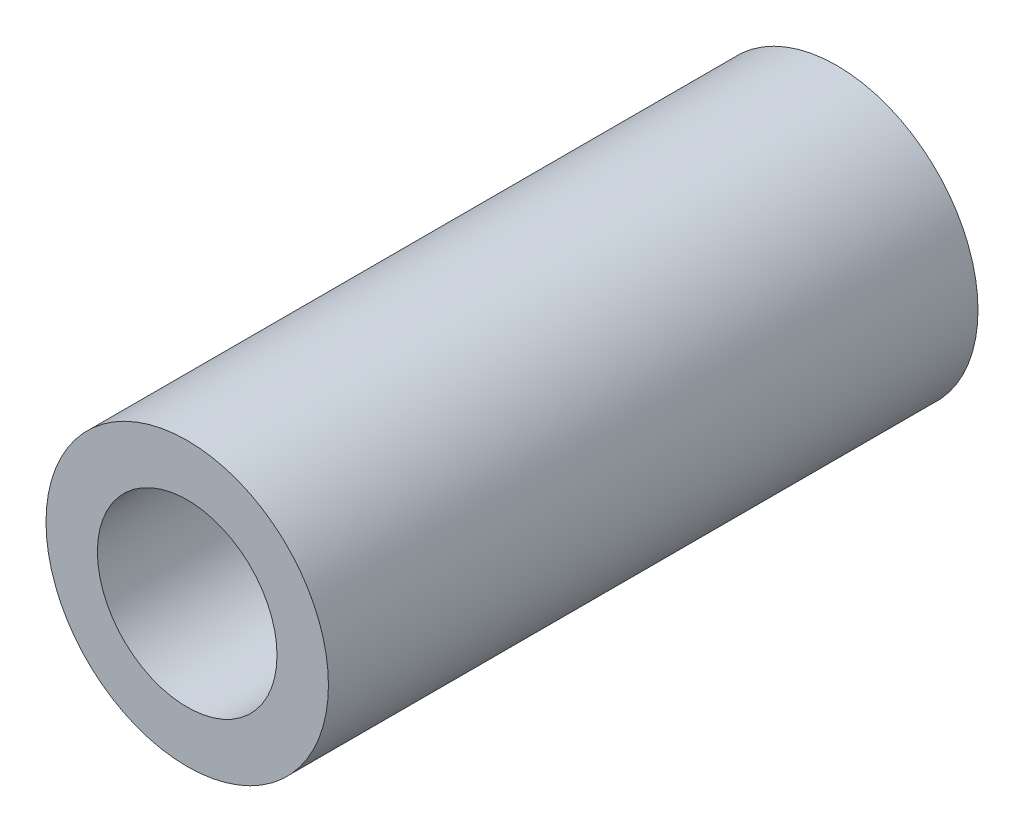
ISO-10303-21;
HEADER;
FILE_DESCRIPTION(('STEP AP214'),'2;1');
FILE_NAME('part.step','',(''),(''),'','','');
FILE_SCHEMA(('AUTOMOTIVE_DESIGN { 1 0 10303 214 1 1 1 1 }'));
ENDSEC;
DATA;
#1=APPLICATION_CONTEXT('core data for automotive mechanical design processes');
#2=APPLICATION_PROTOCOL_DEFINITION('international standard','automotive_design',2000,#1);
#3=PRODUCT_CONTEXT('',#1,'mechanical');
#4=PRODUCT('Part','Part','',(#3));
#5=PRODUCT_RELATED_PRODUCT_CATEGORY('part','',(#4));
#6=PRODUCT_DEFINITION_FORMATION('','',#4);
#7=PRODUCT_DEFINITION_CONTEXT('part definition',#1,'design');
#8=PRODUCT_DEFINITION('design','',#6,#7);
#9=PRODUCT_DEFINITION_SHAPE('','',#8);
#10=(LENGTH_UNIT() NAMED_UNIT(*) SI_UNIT(.MILLI.,.METRE.));
#11=(NAMED_UNIT(*) PLANE_ANGLE_UNIT() SI_UNIT($,.RADIAN.));
#12=(NAMED_UNIT(*) SI_UNIT($,.STERADIAN.) SOLID_ANGLE_UNIT());
#13=UNCERTAINTY_MEASURE_WITH_UNIT(LENGTH_MEASURE(1.E-05),#10,'distance_accuracy_value','');
#14=(GEOMETRIC_REPRESENTATION_CONTEXT(3) GLOBAL_UNCERTAINTY_ASSIGNED_CONTEXT((#13)) GLOBAL_UNIT_ASSIGNED_CONTEXT((#10,
#11,#12)) REPRESENTATION_CONTEXT('',''));
#15=CARTESIAN_POINT('',(0.,0.,0.));
#16=DIRECTION('',(0.,0.,1.));
#17=DIRECTION('',(1.,0.,0.));
#18=AXIS2_PLACEMENT_3D('',#15,#16,#17);
#19=CARTESIAN_POINT('',(0.,0.,115.));
#20=DIRECTION('',(0.,0.,1.));
#21=DIRECTION('',(1.,0.,0.));
#22=AXIS2_PLACEMENT_3D('',#19,#20,#21);
#23=PLANE('',#22);
#24=CARTESIAN_POINT('',(0.,0.,115.));
#25=DIRECTION('',(0.,0.,1.));
#26=DIRECTION('',(1.,0.,0.));
#27=AXIS2_PLACEMENT_3D('',#24,#25,#26);
#28=CIRCLE('',#27,25.);
#29=CARTESIAN_POINT('',(25.,0.,115.));
#30=VERTEX_POINT('',#29);
#31=EDGE_CURVE('E10',#30,#30,#28,.T.);
#32=ORIENTED_EDGE('',*,*,#31,.T.);
#33=EDGE_LOOP('',(#32));
#34=FACE_BOUND('',#33,.T.);
#35=CARTESIAN_POINT('',(0.,0.,115.));
#36=DIRECTION('',(0.,0.,1.));
#37=DIRECTION('',(1.,0.,0.));
#38=AXIS2_PLACEMENT_3D('',#35,#36,#37);
#39=CIRCLE('',#38,15.9);
#40=CARTESIAN_POINT('',(15.9,0.,115.));
#41=VERTEX_POINT('',#40);
#42=EDGE_CURVE('E52',#41,#41,#39,.T.);
#43=ORIENTED_EDGE('',*,*,#42,.F.);
#44=EDGE_LOOP('',(#43));
#45=FACE_BOUND('',#44,.T.);
#46=ADVANCED_FACE('F39',(#34,#45),#23,.T.);
#47=CARTESIAN_POINT('',(0.,0.,0.));
#48=DIRECTION('',(0.,0.,1.));
#49=DIRECTION('',(1.,0.,0.));
#50=AXIS2_PLACEMENT_3D('',#47,#48,#49);
#51=PLANE('',#50);
#52=CARTESIAN_POINT('',(0.,0.,0.));
#53=DIRECTION('',(0.,0.,1.));
#54=DIRECTION('',(1.,0.,0.));
#55=AXIS2_PLACEMENT_3D('',#52,#53,#54);
#56=CIRCLE('',#55,25.);
#57=CARTESIAN_POINT('',(25.,0.,0.));
#58=VERTEX_POINT('',#57);
#59=EDGE_CURVE('E43',#58,#58,#56,.T.);
#60=ORIENTED_EDGE('',*,*,#59,.F.);
#61=EDGE_LOOP('',(#60));
#62=FACE_BOUND('',#61,.T.);
#63=CARTESIAN_POINT('',(0.,0.,0.));
#64=DIRECTION('',(0.,0.,1.));
#65=DIRECTION('',(1.,0.,0.));
#66=AXIS2_PLACEMENT_3D('',#63,#64,#65);
#67=CIRCLE('',#66,15.9);
#68=CARTESIAN_POINT('',(15.9,0.,0.));
#69=VERTEX_POINT('',#68);
#70=EDGE_CURVE('E54',#69,#69,#67,.T.);
#71=ORIENTED_EDGE('',*,*,#70,.T.);
#72=EDGE_LOOP('',(#71));
#73=FACE_BOUND('',#72,.T.);
#74=ADVANCED_FACE('F66',(#62,#73),#51,.F.);
#75=CARTESIAN_POINT('',(0.,0.,115.));
#76=DIRECTION('',(0.,0.,-1.));
#77=DIRECTION('',(-1.,0.,0.));
#78=AXIS2_PLACEMENT_3D('',#75,#76,#77);
#79=CYLINDRICAL_SURFACE('',#78,25.);
#80=ORIENTED_EDGE('',*,*,#31,.F.);
#81=EDGE_LOOP('',(#80));
#82=FACE_BOUND('',#81,.T.);
#83=ORIENTED_EDGE('',*,*,#59,.T.);
#84=EDGE_LOOP('',(#83));
#85=FACE_BOUND('',#84,.T.);
#86=ADVANCED_FACE('F41',(#82,#85),#79,.T.);
#87=CARTESIAN_POINT('',(0.,0.,115.));
#88=DIRECTION('',(0.,0.,-1.));
#89=DIRECTION('',(-1.,0.,0.));
#90=AXIS2_PLACEMENT_3D('',#87,#88,#89);
#91=CYLINDRICAL_SURFACE('',#90,15.9);
#92=ORIENTED_EDGE('',*,*,#42,.T.);
#93=EDGE_LOOP('',(#92));
#94=FACE_BOUND('',#93,.T.);
#95=ORIENTED_EDGE('',*,*,#70,.F.);
#96=EDGE_LOOP('',(#95));
#97=FACE_BOUND('',#96,.T.);
#98=ADVANCED_FACE('F62',(#94,#97),#91,.F.);
#99=CLOSED_SHELL('',(#46,#74,#86,#98));
#100=MANIFOLD_SOLID_BREP('B2',#99);
#101=ADVANCED_BREP_SHAPE_REPRESENTATION('',(#18,#100),#14);
#102=SHAPE_DEFINITION_REPRESENTATION(#9,#101);
ENDSEC;
END-ISO-10303-21;
